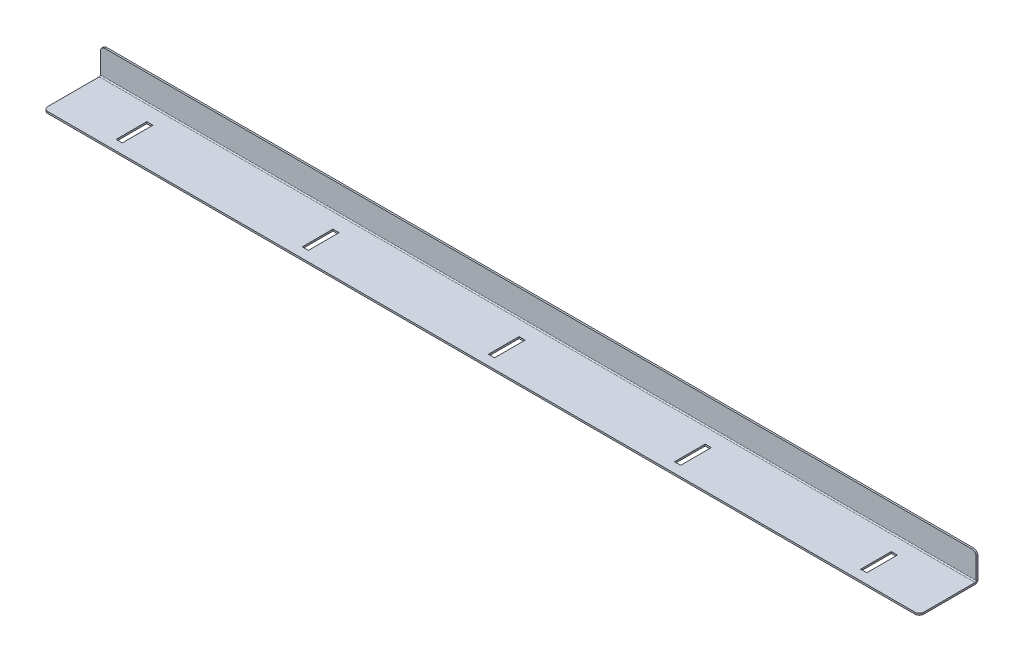
ISO-10303-21;
HEADER;
FILE_DESCRIPTION(('STEP AP214'),'2;1');
FILE_NAME('part.step','',(''),(''),'','','');
FILE_SCHEMA(('AUTOMOTIVE_DESIGN { 1 0 10303 214 1 1 1 1 }'));
ENDSEC;
DATA;
#1=APPLICATION_CONTEXT('core data for automotive mechanical design processes');
#2=APPLICATION_PROTOCOL_DEFINITION('international standard','automotive_design',2000,#1);
#3=PRODUCT_CONTEXT('',#1,'mechanical');
#4=PRODUCT('Part','Part','',(#3));
#5=PRODUCT_RELATED_PRODUCT_CATEGORY('part','',(#4));
#6=PRODUCT_DEFINITION_FORMATION('','',#4);
#7=PRODUCT_DEFINITION_CONTEXT('part definition',#1,'design');
#8=PRODUCT_DEFINITION('design','',#6,#7);
#9=PRODUCT_DEFINITION_SHAPE('','',#8);
#10=(LENGTH_UNIT() NAMED_UNIT(*) SI_UNIT(.MILLI.,.METRE.));
#11=(NAMED_UNIT(*) PLANE_ANGLE_UNIT() SI_UNIT($,.RADIAN.));
#12=(NAMED_UNIT(*) SI_UNIT($,.STERADIAN.) SOLID_ANGLE_UNIT());
#13=UNCERTAINTY_MEASURE_WITH_UNIT(LENGTH_MEASURE(1.E-05),#10,'distance_accuracy_value','');
#14=(GEOMETRIC_REPRESENTATION_CONTEXT(3) GLOBAL_UNCERTAINTY_ASSIGNED_CONTEXT((#13)) GLOBAL_UNIT_ASSIGNED_CONTEXT((#10,
#11,#12)) REPRESENTATION_CONTEXT('',''));
#15=CARTESIAN_POINT('',(0.,0.,0.));
#16=DIRECTION('',(0.,0.,1.));
#17=DIRECTION('',(1.,0.,0.));
#18=AXIS2_PLACEMENT_3D('',#15,#16,#17);
#19=CARTESIAN_POINT('',(500.,1.3,0.));
#20=DIRECTION('',(1.,0.,0.));
#21=DIRECTION('',(0.,0.,-1.));
#22=AXIS2_PLACEMENT_3D('',#19,#20,#21);
#23=PLANE('',#22);
#24=DIRECTION('',(0.,0.,-1.));
#25=VECTOR('',#24,1.);
#26=CARTESIAN_POINT('',(500.,1.3,0.));
#27=LINE('',#26,#25);
#28=CARTESIAN_POINT('',(500.,1.3,0.));
#29=VERTEX_POINT('',#28);
#30=CARTESIAN_POINT('',(500.,1.3,-2.));
#31=VERTEX_POINT('',#30);
#32=EDGE_CURVE('E424',#29,#31,#27,.T.);
#33=ORIENTED_EDGE('',*,*,#32,.F.);
#34=CARTESIAN_POINT('',(500.,1.3,1.3));
#35=DIRECTION('',(1.,0.,0.));
#36=DIRECTION('',(0.,0.,-1.));
#37=AXIS2_PLACEMENT_3D('',#34,#35,#36);
#38=CIRCLE('',#37,1.3);
#39=CARTESIAN_POINT('',(500.,0.,1.3));
#40=VERTEX_POINT('',#39);
#41=EDGE_CURVE('E368',#40,#29,#38,.T.);
#42=ORIENTED_EDGE('',*,*,#41,.F.);
#43=DIRECTION('',(0.,1.,0.));
#44=VECTOR('',#43,1.);
#45=CARTESIAN_POINT('',(500.,-2.,1.3));
#46=LINE('',#45,#44);
#47=CARTESIAN_POINT('',(500.,-2.,1.3));
#48=VERTEX_POINT('',#47);
#49=EDGE_CURVE('E421',#48,#40,#46,.T.);
#50=ORIENTED_EDGE('',*,*,#49,.F.);
#51=CARTESIAN_POINT('',(500.,1.3,1.3));
#52=DIRECTION('',(1.,0.,0.));
#53=DIRECTION('',(0.,0.,-1.));
#54=AXIS2_PLACEMENT_3D('',#51,#52,#53);
#55=CIRCLE('',#54,3.3);
#56=EDGE_CURVE('E375',#48,#31,#55,.T.);
#57=ORIENTED_EDGE('',*,*,#56,.T.);
#58=EDGE_LOOP('',(#33,#42,#50,#57));
#59=FACE_BOUND('',#58,.T.);
#60=ADVANCED_FACE('F38',(#59),#23,.T.);
#61=CARTESIAN_POINT('',(500.,-2.,1.3));
#62=DIRECTION('',(1.,0.,0.));
#63=DIRECTION('',(0.,0.,-1.));
#64=AXIS2_PLACEMENT_3D('',#61,#62,#63);
#65=PLANE('',#64);
#66=DIRECTION('',(0.,1.,0.));
#67=VECTOR('',#66,1.);
#68=CARTESIAN_POINT('',(500.,0.,-2.));
#69=LINE('',#68,#67);
#70=CARTESIAN_POINT('',(500.,25.,-2.));
#71=VERTEX_POINT('',#70);
#72=EDGE_CURVE('E361',#31,#71,#69,.T.);
#73=ORIENTED_EDGE('',*,*,#72,.T.);
#74=DIRECTION('',(0.,0.,-1.));
#75=VECTOR('',#74,1.);
#76=CARTESIAN_POINT('',(500.,25.,1.3));
#77=LINE('',#76,#75);
#78=CARTESIAN_POINT('',(500.,25.,0.));
#79=VERTEX_POINT('',#78);
#80=EDGE_CURVE('E435',#71,#79,#77,.F.);
#81=ORIENTED_EDGE('',*,*,#80,.T.);
#82=DIRECTION('',(0.,1.,0.));
#83=VECTOR('',#82,1.);
#84=CARTESIAN_POINT('',(500.,0.,0.));
#85=LINE('',#84,#83);
#86=EDGE_CURVE('E364',#29,#79,#85,.T.);
#87=ORIENTED_EDGE('',*,*,#86,.F.);
#88=ORIENTED_EDGE('',*,*,#32,.T.);
#89=EDGE_LOOP('',(#73,#81,#87,#88));
#90=FACE_BOUND('',#89,.T.);
#91=ADVANCED_FACE('F545',(#90),#65,.T.);
#92=CARTESIAN_POINT('',(-500.,0.,1.3));
#93=DIRECTION('',(-1.,0.,0.));
#94=DIRECTION('',(0.,0.,1.));
#95=AXIS2_PLACEMENT_3D('',#92,#93,#94);
#96=PLANE('',#95);
#97=DIRECTION('',(0.,-1.,0.));
#98=VECTOR('',#97,1.);
#99=CARTESIAN_POINT('',(-500.,0.,1.3));
#100=LINE('',#99,#98);
#101=CARTESIAN_POINT('',(-500.,0.,1.3));
#102=VERTEX_POINT('',#101);
#103=CARTESIAN_POINT('',(-500.,-2.,1.3));
#104=VERTEX_POINT('',#103);
#105=EDGE_CURVE('E418',#102,#104,#100,.T.);
#106=ORIENTED_EDGE('',*,*,#105,.F.);
#107=CARTESIAN_POINT('',(-500.,1.3,1.3));
#108=DIRECTION('',(1.,0.,0.));
#109=DIRECTION('',(0.,0.,-1.));
#110=AXIS2_PLACEMENT_3D('',#107,#108,#109);
#111=CIRCLE('',#110,1.3);
#112=CARTESIAN_POINT('',(-500.,1.3,0.));
#113=VERTEX_POINT('',#112);
#114=EDGE_CURVE('E384',#102,#113,#111,.T.);
#115=ORIENTED_EDGE('',*,*,#114,.T.);
#116=DIRECTION('',(0.,0.,1.));
#117=VECTOR('',#116,1.);
#118=CARTESIAN_POINT('',(-500.,1.3,-2.));
#119=LINE('',#118,#117);
#120=CARTESIAN_POINT('',(-500.,1.3,-2.));
#121=VERTEX_POINT('',#120);
#122=EDGE_CURVE('E416',#121,#113,#119,.T.);
#123=ORIENTED_EDGE('',*,*,#122,.F.);
#124=CARTESIAN_POINT('',(-500.,1.3,1.3));
#125=DIRECTION('',(1.,0.,0.));
#126=DIRECTION('',(0.,0.,-1.));
#127=AXIS2_PLACEMENT_3D('',#124,#125,#126);
#128=CIRCLE('',#127,3.3);
#129=EDGE_CURVE('E365',#104,#121,#128,.T.);
#130=ORIENTED_EDGE('',*,*,#129,.F.);
#131=EDGE_LOOP('',(#106,#115,#123,#130));
#132=FACE_BOUND('',#131,.T.);
#133=ADVANCED_FACE('F551',(#132),#96,.T.);
#134=CARTESIAN_POINT('',(-500.,1.3,-2.));
#135=DIRECTION('',(-1.,0.,0.));
#136=DIRECTION('',(0.,0.,1.));
#137=AXIS2_PLACEMENT_3D('',#134,#135,#136);
#138=PLANE('',#137);
#139=DIRECTION('',(0.,0.,-1.));
#140=VECTOR('',#139,1.);
#141=CARTESIAN_POINT('',(-500.,-2.,0.));
#142=LINE('',#141,#140);
#143=CARTESIAN_POINT('',(-500.,-2.00000000000001,60.));
#144=VERTEX_POINT('',#143);
#145=EDGE_CURVE('E389',#144,#104,#142,.T.);
#146=ORIENTED_EDGE('',*,*,#145,.F.);
#147=DIRECTION('',(0.,1.,0.));
#148=VECTOR('',#147,1.);
#149=CARTESIAN_POINT('',(-500.,1.3,60.));
#150=LINE('',#149,#148);
#151=CARTESIAN_POINT('',(-500.,0.,60.));
#152=VERTEX_POINT('',#151);
#153=EDGE_CURVE('E456',#144,#152,#150,.T.);
#154=ORIENTED_EDGE('',*,*,#153,.T.);
#155=DIRECTION('',(0.,0.,-1.));
#156=VECTOR('',#155,1.);
#157=CARTESIAN_POINT('',(-500.,0.,0.));
#158=LINE('',#157,#156);
#159=EDGE_CURVE('E387',#152,#102,#158,.T.);
#160=ORIENTED_EDGE('',*,*,#159,.T.);
#161=ORIENTED_EDGE('',*,*,#105,.T.);
#162=EDGE_LOOP('',(#146,#154,#160,#161));
#163=FACE_BOUND('',#162,.T.);
#164=ADVANCED_FACE('F581',(#163),#138,.T.);
#165=CARTESIAN_POINT('',(500.,0.,-2.));
#166=DIRECTION('',(0.,0.,1.));
#167=DIRECTION('',(1.,0.,0.));
#168=AXIS2_PLACEMENT_3D('',#165,#166,#167);
#169=PLANE('',#168);
#170=DIRECTION('',(-1.,0.,0.));
#171=VECTOR('',#170,1.);
#172=CARTESIAN_POINT('',(500.,30.,-2.));
#173=LINE('',#172,#171);
#174=CARTESIAN_POINT('',(495.,30.,-2.));
#175=VERTEX_POINT('',#174);
#176=CARTESIAN_POINT('',(-495.,30.,-2.));
#177=VERTEX_POINT('',#176);
#178=EDGE_CURVE('E413',#175,#177,#173,.T.);
#179=ORIENTED_EDGE('',*,*,#178,.F.);
#180=CARTESIAN_POINT('',(495.,25.,-2.));
#181=DIRECTION('',(0.,0.,1.));
#182=DIRECTION('',(1.,0.,0.));
#183=AXIS2_PLACEMENT_3D('',#180,#181,#182);
#184=CIRCLE('',#183,5.);
#185=EDGE_CURVE('E433',#175,#71,#184,.F.);
#186=ORIENTED_EDGE('',*,*,#185,.T.);
#187=ORIENTED_EDGE('',*,*,#72,.F.);
#188=DIRECTION('',(-1.,0.,0.));
#189=VECTOR('',#188,1.);
#190=CARTESIAN_POINT('',(500.,1.3,-2.));
#191=LINE('',#190,#189);
#192=EDGE_CURVE('E378',#31,#121,#191,.T.);
#193=ORIENTED_EDGE('',*,*,#192,.T.);
#194=DIRECTION('',(0.,1.,0.));
#195=VECTOR('',#194,1.);
#196=CARTESIAN_POINT('',(-500.,0.,-2.));
#197=LINE('',#196,#195);
#198=CARTESIAN_POINT('',(-500.,25.,-2.));
#199=VERTEX_POINT('',#198);
#200=EDGE_CURVE('E354',#121,#199,#197,.T.);
#201=ORIENTED_EDGE('',*,*,#200,.T.);
#202=CARTESIAN_POINT('',(-495.,25.,-2.));
#203=DIRECTION('',(0.,0.,1.));
#204=DIRECTION('',(1.,0.,0.));
#205=AXIS2_PLACEMENT_3D('',#202,#203,#204);
#206=CIRCLE('',#205,5.);
#207=EDGE_CURVE('E431',#199,#177,#206,.F.);
#208=ORIENTED_EDGE('',*,*,#207,.T.);
#209=EDGE_LOOP('',(#179,#186,#187,#193,#201,#208));
#210=FACE_BOUND('',#209,.T.);
#211=ADVANCED_FACE('F608',(#210),#169,.F.);
#212=CARTESIAN_POINT('',(500.,30.,0.));
#213=DIRECTION('',(0.,1.,0.));
#214=DIRECTION('',(0.,0.,1.));
#215=AXIS2_PLACEMENT_3D('',#212,#213,#214);
#216=PLANE('',#215);
#217=DIRECTION('',(-1.,0.,0.));
#218=VECTOR('',#217,1.);
#219=CARTESIAN_POINT('',(500.,30.,0.));
#220=LINE('',#219,#218);
#221=CARTESIAN_POINT('',(495.,30.,0.));
#222=VERTEX_POINT('',#221);
#223=CARTESIAN_POINT('',(-495.,30.,0.));
#224=VERTEX_POINT('',#223);
#225=EDGE_CURVE('E410',#222,#224,#220,.T.);
#226=ORIENTED_EDGE('',*,*,#225,.F.);
#227=DIRECTION('',(0.,0.,-1.));
#228=VECTOR('',#227,1.);
#229=CARTESIAN_POINT('',(495.,30.,0.));
#230=LINE('',#229,#228);
#231=EDGE_CURVE('E428',#222,#175,#230,.T.);
#232=ORIENTED_EDGE('',*,*,#231,.T.);
#233=ORIENTED_EDGE('',*,*,#178,.T.);
#234=DIRECTION('',(0.,0.,-1.));
#235=VECTOR('',#234,1.);
#236=CARTESIAN_POINT('',(-495.,30.,0.));
#237=LINE('',#236,#235);
#238=EDGE_CURVE('E426',#177,#224,#237,.F.);
#239=ORIENTED_EDGE('',*,*,#238,.T.);
#240=EDGE_LOOP('',(#226,#232,#233,#239));
#241=FACE_BOUND('',#240,.T.);
#242=ADVANCED_FACE('F614',(#241),#216,.T.);
#243=CARTESIAN_POINT('',(500.,0.,0.));
#244=DIRECTION('',(0.,0.,1.));
#245=DIRECTION('',(1.,0.,0.));
#246=AXIS2_PLACEMENT_3D('',#243,#244,#245);
#247=PLANE('',#246);
#248=ORIENTED_EDGE('',*,*,#86,.T.);
#249=CARTESIAN_POINT('',(495.,25.,0.));
#250=DIRECTION('',(0.,0.,1.));
#251=DIRECTION('',(1.,0.,0.));
#252=AXIS2_PLACEMENT_3D('',#249,#250,#251);
#253=CIRCLE('',#252,5.);
#254=EDGE_CURVE('E439',#79,#222,#253,.T.);
#255=ORIENTED_EDGE('',*,*,#254,.T.);
#256=ORIENTED_EDGE('',*,*,#225,.T.);
#257=CARTESIAN_POINT('',(-495.,25.,0.));
#258=DIRECTION('',(0.,0.,1.));
#259=DIRECTION('',(1.,0.,0.));
#260=AXIS2_PLACEMENT_3D('',#257,#258,#259);
#261=CIRCLE('',#260,5.);
#262=CARTESIAN_POINT('',(-500.,25.,0.));
#263=VERTEX_POINT('',#262);
#264=EDGE_CURVE('E437',#224,#263,#261,.T.);
#265=ORIENTED_EDGE('',*,*,#264,.T.);
#266=DIRECTION('',(0.,1.,0.));
#267=VECTOR('',#266,1.);
#268=CARTESIAN_POINT('',(-500.,0.,0.));
#269=LINE('',#268,#267);
#270=EDGE_CURVE('E381',#113,#263,#269,.T.);
#271=ORIENTED_EDGE('',*,*,#270,.F.);
#272=DIRECTION('',(-1.,0.,0.));
#273=VECTOR('',#272,1.);
#274=CARTESIAN_POINT('',(500.,1.3,0.));
#275=LINE('',#274,#273);
#276=EDGE_CURVE('E407',#29,#113,#275,.T.);
#277=ORIENTED_EDGE('',*,*,#276,.F.);
#278=EDGE_LOOP('',(#248,#255,#256,#265,#271,#277));
#279=FACE_BOUND('',#278,.T.);
#280=ADVANCED_FACE('F602',(#279),#247,.T.);
#281=CARTESIAN_POINT('',(500.,1.3,1.3));
#282=DIRECTION('',(-1.,0.,0.));
#283=DIRECTION('',(0.,0.,1.));
#284=AXIS2_PLACEMENT_3D('',#281,#282,#283);
#285=CYLINDRICAL_SURFACE('',#284,1.3);
#286=ORIENTED_EDGE('',*,*,#114,.F.);
#287=DIRECTION('',(-1.,0.,0.));
#288=VECTOR('',#287,1.);
#289=CARTESIAN_POINT('',(500.,0.,1.3));
#290=LINE('',#289,#288);
#291=EDGE_CURVE('E404',#40,#102,#290,.T.);
#292=ORIENTED_EDGE('',*,*,#291,.F.);
#293=ORIENTED_EDGE('',*,*,#41,.T.);
#294=ORIENTED_EDGE('',*,*,#276,.T.);
#295=EDGE_LOOP('',(#286,#292,#293,#294));
#296=FACE_BOUND('',#295,.T.);
#297=ADVANCED_FACE('F597',(#296),#285,.F.);
#298=CARTESIAN_POINT('',(500.,0.,0.));
#299=DIRECTION('',(0.,1.,0.));
#300=DIRECTION('',(0.,0.,1.));
#301=AXIS2_PLACEMENT_3D('',#298,#299,#300);
#302=PLANE('',#301);
#303=DIRECTION('',(-1.,0.,0.));
#304=VECTOR('',#303,1.);
#305=CARTESIAN_POINT('',(3.50000000000006,0.,18.5));
#306=LINE('',#305,#304);
#307=CARTESIAN_POINT('',(3.50000000000006,0.,18.5));
#308=VERTEX_POINT('',#307);
#309=CARTESIAN_POINT('',(-3.49999999999998,0.,18.5));
#310=VERTEX_POINT('',#309);
#311=EDGE_CURVE('E53',#308,#310,#306,.T.);
#312=ORIENTED_EDGE('',*,*,#311,.F.);
#313=DIRECTION('',(0.,0.,-1.));
#314=VECTOR('',#313,1.);
#315=CARTESIAN_POINT('',(3.5,0.,53.5000000000001));
#316=LINE('',#315,#314);
#317=CARTESIAN_POINT('',(3.5,0.,53.5000000000001));
#318=VERTEX_POINT('',#317);
#319=EDGE_CURVE('E312',#318,#308,#316,.T.);
#320=ORIENTED_EDGE('',*,*,#319,.F.);
#321=DIRECTION('',(1.,0.,0.));
#322=VECTOR('',#321,1.);
#323=CARTESIAN_POINT('',(3.5,0.,53.5000000000001));
#324=LINE('',#323,#322);
#325=CARTESIAN_POINT('',(-3.5,0.,53.5000000000001));
#326=VERTEX_POINT('',#325);
#327=EDGE_CURVE('E309',#326,#318,#324,.T.);
#328=ORIENTED_EDGE('',*,*,#327,.F.);
#329=DIRECTION('',(0.,0.,1.));
#330=VECTOR('',#329,1.);
#331=CARTESIAN_POINT('',(-3.5,0.,53.5000000000001));
#332=LINE('',#331,#330);
#333=EDGE_CURVE('E305',#310,#326,#332,.T.);
#334=ORIENTED_EDGE('',*,*,#333,.F.);
#335=EDGE_LOOP('',(#312,#320,#328,#334));
#336=FACE_BOUND('',#335,.T.);
#337=DIRECTION('',(-1.,0.,0.));
#338=VECTOR('',#337,1.);
#339=CARTESIAN_POINT('',(216.,0.,18.5));
#340=LINE('',#339,#338);
#341=CARTESIAN_POINT('',(216.,0.,18.5));
#342=VERTEX_POINT('',#341);
#343=CARTESIAN_POINT('',(209.,0.,18.5));
#344=VERTEX_POINT('',#343);
#345=EDGE_CURVE('E61',#342,#344,#340,.T.);
#346=ORIENTED_EDGE('',*,*,#345,.F.);
#347=DIRECTION('',(0.,0.,-1.));
#348=VECTOR('',#347,1.);
#349=CARTESIAN_POINT('',(216.,0.,53.5000000000001));
#350=LINE('',#349,#348);
#351=CARTESIAN_POINT('',(216.,0.,53.5000000000001));
#352=VERTEX_POINT('',#351);
#353=EDGE_CURVE('E331',#352,#342,#350,.T.);
#354=ORIENTED_EDGE('',*,*,#353,.F.);
#355=DIRECTION('',(1.,0.,0.));
#356=VECTOR('',#355,1.);
#357=CARTESIAN_POINT('',(216.,0.,53.5000000000001));
#358=LINE('',#357,#356);
#359=CARTESIAN_POINT('',(209.,0.,53.5000000000001));
#360=VERTEX_POINT('',#359);
#361=EDGE_CURVE('E328',#360,#352,#358,.T.);
#362=ORIENTED_EDGE('',*,*,#361,.F.);
#363=DIRECTION('',(0.,0.,1.));
#364=VECTOR('',#363,1.);
#365=CARTESIAN_POINT('',(209.,0.,53.5000000000001));
#366=LINE('',#365,#364);
#367=EDGE_CURVE('E325',#344,#360,#366,.T.);
#368=ORIENTED_EDGE('',*,*,#367,.F.);
#369=EDGE_LOOP('',(#346,#354,#362,#368));
#370=FACE_BOUND('',#369,.T.);
#371=DIRECTION('',(-1.,0.,0.));
#372=VECTOR('',#371,1.);
#373=CARTESIAN_POINT('',(428.5,0.,18.5));
#374=LINE('',#373,#372);
#375=CARTESIAN_POINT('',(428.5,0.,18.5));
#376=VERTEX_POINT('',#375);
#377=CARTESIAN_POINT('',(421.5,0.,18.5));
#378=VERTEX_POINT('',#377);
#379=EDGE_CURVE('E270',#376,#378,#374,.T.);
#380=ORIENTED_EDGE('',*,*,#379,.F.);
#381=DIRECTION('',(0.,0.,-1.));
#382=VECTOR('',#381,1.);
#383=CARTESIAN_POINT('',(428.5,0.,53.5000000000001));
#384=LINE('',#383,#382);
#385=CARTESIAN_POINT('',(428.5,0.,53.5000000000001));
#386=VERTEX_POINT('',#385);
#387=EDGE_CURVE('E275',#386,#376,#384,.T.);
#388=ORIENTED_EDGE('',*,*,#387,.F.);
#389=DIRECTION('',(1.,0.,0.));
#390=VECTOR('',#389,1.);
#391=CARTESIAN_POINT('',(428.5,0.,53.5000000000001));
#392=LINE('',#391,#390);
#393=CARTESIAN_POINT('',(421.5,0.,53.5));
#394=VERTEX_POINT('',#393);
#395=EDGE_CURVE('E254',#394,#386,#392,.T.);
#396=ORIENTED_EDGE('',*,*,#395,.F.);
#397=DIRECTION('',(0.,0.,1.));
#398=VECTOR('',#397,1.);
#399=CARTESIAN_POINT('',(421.5,0.,53.5));
#400=LINE('',#399,#398);
#401=EDGE_CURVE('E265',#378,#394,#400,.T.);
#402=ORIENTED_EDGE('',*,*,#401,.F.);
#403=EDGE_LOOP('',(#380,#388,#396,#402));
#404=FACE_BOUND('',#403,.T.);
#405=DIRECTION('',(0.,0.,1.));
#406=VECTOR('',#405,1.);
#407=CARTESIAN_POINT('',(-428.5,0.,53.5000000000001));
#408=LINE('',#407,#406);
#409=CARTESIAN_POINT('',(-428.5,0.,18.5));
#410=VERTEX_POINT('',#409);
#411=CARTESIAN_POINT('',(-428.5,0.,53.5000000000001));
#412=VERTEX_POINT('',#411);
#413=EDGE_CURVE('E284',#410,#412,#408,.T.);
#414=ORIENTED_EDGE('',*,*,#413,.F.);
#415=DIRECTION('',(-1.,0.,0.));
#416=VECTOR('',#415,1.);
#417=CARTESIAN_POINT('',(-421.5,0.,18.5));
#418=LINE('',#417,#416);
#419=CARTESIAN_POINT('',(-421.5,0.,18.5));
#420=VERTEX_POINT('',#419);
#421=EDGE_CURVE('E292',#420,#410,#418,.T.);
#422=ORIENTED_EDGE('',*,*,#421,.F.);
#423=DIRECTION('',(0.,0.,-1.));
#424=VECTOR('',#423,1.);
#425=CARTESIAN_POINT('',(-421.5,0.,53.5000000000001));
#426=LINE('',#425,#424);
#427=CARTESIAN_POINT('',(-421.5,0.,53.5000000000001));
#428=VERTEX_POINT('',#427);
#429=EDGE_CURVE('E289',#428,#420,#426,.T.);
#430=ORIENTED_EDGE('',*,*,#429,.F.);
#431=DIRECTION('',(1.,0.,0.));
#432=VECTOR('',#431,1.);
#433=CARTESIAN_POINT('',(-421.5,0.,53.5000000000001));
#434=LINE('',#433,#432);
#435=EDGE_CURVE('E286',#412,#428,#434,.T.);
#436=ORIENTED_EDGE('',*,*,#435,.F.);
#437=EDGE_LOOP('',(#414,#422,#430,#436));
#438=FACE_BOUND('',#437,.T.);
#439=DIRECTION('',(-1.,0.,0.));
#440=VECTOR('',#439,1.);
#441=CARTESIAN_POINT('',(-209.,0.,18.5));
#442=LINE('',#441,#440);
#443=CARTESIAN_POINT('',(-209.,0.,18.5));
#444=VERTEX_POINT('',#443);
#445=CARTESIAN_POINT('',(-216.,0.,18.5));
#446=VERTEX_POINT('',#445);
#447=EDGE_CURVE('E318',#444,#446,#442,.T.);
#448=ORIENTED_EDGE('',*,*,#447,.F.);
#449=DIRECTION('',(0.,0.,-1.));
#450=VECTOR('',#449,1.);
#451=CARTESIAN_POINT('',(-209.,0.,53.5000000000001));
#452=LINE('',#451,#450);
#453=CARTESIAN_POINT('',(-209.,0.,53.5000000000001));
#454=VERTEX_POINT('',#453);
#455=EDGE_CURVE('E348',#454,#444,#452,.T.);
#456=ORIENTED_EDGE('',*,*,#455,.F.);
#457=DIRECTION('',(1.,0.,0.));
#458=VECTOR('',#457,1.);
#459=CARTESIAN_POINT('',(-209.,0.,53.5000000000001));
#460=LINE('',#459,#458);
#461=CARTESIAN_POINT('',(-216.,0.,53.5000000000001));
#462=VERTEX_POINT('',#461);
#463=EDGE_CURVE('E345',#462,#454,#460,.T.);
#464=ORIENTED_EDGE('',*,*,#463,.F.);
#465=DIRECTION('',(0.,0.,1.));
#466=VECTOR('',#465,1.);
#467=CARTESIAN_POINT('',(-216.,0.,53.5000000000001));
#468=LINE('',#467,#466);
#469=EDGE_CURVE('E342',#446,#462,#468,.T.);
#470=ORIENTED_EDGE('',*,*,#469,.F.);
#471=EDGE_LOOP('',(#448,#456,#464,#470));
#472=FACE_BOUND('',#471,.T.);
#473=DIRECTION('',(-1.,0.,0.));
#474=VECTOR('',#473,1.);
#475=CARTESIAN_POINT('',(500.,0.,65.));
#476=LINE('',#475,#474);
#477=CARTESIAN_POINT('',(495.,0.,65.));
#478=VERTEX_POINT('',#477);
#479=CARTESIAN_POINT('',(-495.,0.,65.));
#480=VERTEX_POINT('',#479);
#481=EDGE_CURVE('E401',#478,#480,#476,.T.);
#482=ORIENTED_EDGE('',*,*,#481,.F.);
#483=CARTESIAN_POINT('',(495.,0.,60.));
#484=DIRECTION('',(0.,1.,0.));
#485=DIRECTION('',(0.,0.,1.));
#486=AXIS2_PLACEMENT_3D('',#483,#484,#485);
#487=CIRCLE('',#486,5.);
#488=CARTESIAN_POINT('',(500.,0.,60.));
#489=VERTEX_POINT('',#488);
#490=EDGE_CURVE('E448',#478,#489,#487,.T.);
#491=ORIENTED_EDGE('',*,*,#490,.T.);
#492=DIRECTION('',(0.,0.,-1.));
#493=VECTOR('',#492,1.);
#494=CARTESIAN_POINT('',(500.,0.,0.));
#495=LINE('',#494,#493);
#496=EDGE_CURVE('E371',#489,#40,#495,.T.);
#497=ORIENTED_EDGE('',*,*,#496,.T.);
#498=ORIENTED_EDGE('',*,*,#291,.T.);
#499=ORIENTED_EDGE('',*,*,#159,.F.);
#500=CARTESIAN_POINT('',(-495.,0.,60.));
#501=DIRECTION('',(0.,1.,0.));
#502=DIRECTION('',(0.,0.,1.));
#503=AXIS2_PLACEMENT_3D('',#500,#501,#502);
#504=CIRCLE('',#503,5.);
#505=EDGE_CURVE('E446',#152,#480,#504,.T.);
#506=ORIENTED_EDGE('',*,*,#505,.T.);
#507=EDGE_LOOP('',(#482,#491,#497,#498,#499,#506));
#508=FACE_BOUND('',#507,.T.);
#509=ADVANCED_FACE('F272',(#336,#370,#404,#438,#472,#508),#302,.T.);
#510=CARTESIAN_POINT('',(500.,-2.00000000000001,65.));
#511=DIRECTION('',(0.,0.,1.));
#512=DIRECTION('',(1.,0.,0.));
#513=AXIS2_PLACEMENT_3D('',#510,#511,#512);
#514=PLANE('',#513);
#515=DIRECTION('',(-1.,0.,0.));
#516=VECTOR('',#515,1.);
#517=CARTESIAN_POINT('',(500.,-2.00000000000001,65.));
#518=LINE('',#517,#516);
#519=CARTESIAN_POINT('',(495.,-2.00000000000001,65.));
#520=VERTEX_POINT('',#519);
#521=CARTESIAN_POINT('',(-495.,-2.00000000000001,65.));
#522=VERTEX_POINT('',#521);
#523=EDGE_CURVE('E398',#520,#522,#518,.T.);
#524=ORIENTED_EDGE('',*,*,#523,.F.);
#525=DIRECTION('',(0.,1.,0.));
#526=VECTOR('',#525,1.);
#527=CARTESIAN_POINT('',(495.,-2.00000000000001,65.));
#528=LINE('',#527,#526);
#529=EDGE_CURVE('E443',#520,#478,#528,.T.);
#530=ORIENTED_EDGE('',*,*,#529,.T.);
#531=ORIENTED_EDGE('',*,*,#481,.T.);
#532=DIRECTION('',(0.,1.,0.));
#533=VECTOR('',#532,1.);
#534=CARTESIAN_POINT('',(-495.,-2.00000000000001,65.));
#535=LINE('',#534,#533);
#536=EDGE_CURVE('E441',#480,#522,#535,.F.);
#537=ORIENTED_EDGE('',*,*,#536,.T.);
#538=EDGE_LOOP('',(#524,#530,#531,#537));
#539=FACE_BOUND('',#538,.T.);
#540=ADVANCED_FACE('F660',(#539),#514,.T.);
#541=CARTESIAN_POINT('',(500.,-2.,0.));
#542=DIRECTION('',(0.,1.,0.));
#543=DIRECTION('',(0.,0.,1.));
#544=AXIS2_PLACEMENT_3D('',#541,#542,#543);
#545=PLANE('',#544);
#546=DIRECTION('',(0.,0.,-1.));
#547=VECTOR('',#546,1.);
#548=CARTESIAN_POINT('',(3.50000000000011,-2.,-7.8771026039753E-13));
#549=LINE('',#548,#547);
#550=CARTESIAN_POINT('',(3.5,-2.00000000000001,53.5000000000001));
#551=VERTEX_POINT('',#550);
#552=CARTESIAN_POINT('',(3.50000000000006,-2.00000000000001,18.5));
#553=VERTEX_POINT('',#552);
#554=EDGE_CURVE('E46',#551,#553,#549,.T.);
#555=ORIENTED_EDGE('',*,*,#554,.T.);
#556=DIRECTION('',(-1.,0.,0.));
#557=VECTOR('',#556,1.);
#558=CARTESIAN_POINT('',(500.,-2.,18.5));
#559=LINE('',#558,#557);
#560=CARTESIAN_POINT('',(-3.49999999999995,-2.00000000000001,18.5));
#561=VERTEX_POINT('',#560);
#562=EDGE_CURVE('E11',#553,#561,#559,.T.);
#563=ORIENTED_EDGE('',*,*,#562,.T.);
#564=DIRECTION('',(0.,0.,1.));
#565=VECTOR('',#564,1.);
#566=CARTESIAN_POINT('',(-3.49999999999995,-2.,-7.98812490643781E-13));
#567=LINE('',#566,#565);
#568=CARTESIAN_POINT('',(-3.50000000000003,-2.00000000000001,53.5000000000001));
#569=VERTEX_POINT('',#568);
#570=EDGE_CURVE('E507',#561,#569,#567,.T.);
#571=ORIENTED_EDGE('',*,*,#570,.T.);
#572=DIRECTION('',(1.,0.,0.));
#573=VECTOR('',#572,1.);
#574=CARTESIAN_POINT('',(500.,-2.00000000000001,53.5000000000001));
#575=LINE('',#574,#573);
#576=EDGE_CURVE('E510',#569,#551,#575,.T.);
#577=ORIENTED_EDGE('',*,*,#576,.T.);
#578=EDGE_LOOP('',(#555,#563,#571,#577));
#579=FACE_BOUND('',#578,.T.);
#580=DIRECTION('',(0.,0.,-1.));
#581=VECTOR('',#580,1.);
#582=CARTESIAN_POINT('',(216.,-2.,0.));
#583=LINE('',#582,#581);
#584=CARTESIAN_POINT('',(216.,-2.00000000000001,53.5000000000001));
#585=VERTEX_POINT('',#584);
#586=CARTESIAN_POINT('',(216.,-2.00000000000001,18.5));
#587=VERTEX_POINT('',#586);
#588=EDGE_CURVE('E501',#585,#587,#583,.T.);
#589=ORIENTED_EDGE('',*,*,#588,.T.);
#590=DIRECTION('',(-1.,0.,0.));
#591=VECTOR('',#590,1.);
#592=CARTESIAN_POINT('',(500.,-2.,18.5));
#593=LINE('',#592,#591);
#594=CARTESIAN_POINT('',(209.,-2.00000000000001,18.5));
#595=VERTEX_POINT('',#594);
#596=EDGE_CURVE('E504',#587,#595,#593,.T.);
#597=ORIENTED_EDGE('',*,*,#596,.T.);
#598=DIRECTION('',(0.,0.,1.));
#599=VECTOR('',#598,1.);
#600=CARTESIAN_POINT('',(209.,-2.,0.));
#601=LINE('',#600,#599);
#602=CARTESIAN_POINT('',(209.,-2.00000000000001,53.5000000000001));
#603=VERTEX_POINT('',#602);
#604=EDGE_CURVE('E495',#595,#603,#601,.T.);
#605=ORIENTED_EDGE('',*,*,#604,.T.);
#606=DIRECTION('',(1.,0.,0.));
#607=VECTOR('',#606,1.);
#608=CARTESIAN_POINT('',(500.,-2.00000000000001,53.5000000000001));
#609=LINE('',#608,#607);
#610=EDGE_CURVE('E498',#603,#585,#609,.T.);
#611=ORIENTED_EDGE('',*,*,#610,.T.);
#612=EDGE_LOOP('',(#589,#597,#605,#611));
#613=FACE_BOUND('',#612,.T.);
#614=DIRECTION('',(0.,0.,-1.));
#615=VECTOR('',#614,1.);
#616=CARTESIAN_POINT('',(428.5,-2.,-1.13646281160827E-13));
#617=LINE('',#616,#615);
#618=CARTESIAN_POINT('',(428.5,-2.00000000000001,53.5000000000001));
#619=VERTEX_POINT('',#618);
#620=CARTESIAN_POINT('',(428.5,-2.00000000000001,18.5));
#621=VERTEX_POINT('',#620);
#622=EDGE_CURVE('E489',#619,#621,#617,.T.);
#623=ORIENTED_EDGE('',*,*,#622,.T.);
#624=DIRECTION('',(-1.,0.,0.));
#625=VECTOR('',#624,1.);
#626=CARTESIAN_POINT('',(500.,-2.,18.5));
#627=LINE('',#626,#625);
#628=CARTESIAN_POINT('',(421.5,-2.00000000000001,18.5));
#629=VERTEX_POINT('',#628);
#630=EDGE_CURVE('E492',#621,#629,#627,.T.);
#631=ORIENTED_EDGE('',*,*,#630,.T.);
#632=DIRECTION('',(0.,0.,1.));
#633=VECTOR('',#632,1.);
#634=CARTESIAN_POINT('',(421.5,-2.,-1.24748511407079E-13));
#635=LINE('',#634,#633);
#636=CARTESIAN_POINT('',(421.5,-2.00000000000001,53.5));
#637=VERTEX_POINT('',#636);
#638=EDGE_CURVE('E486',#629,#637,#635,.T.);
#639=ORIENTED_EDGE('',*,*,#638,.T.);
#640=DIRECTION('',(1.,0.,0.));
#641=VECTOR('',#640,1.);
#642=CARTESIAN_POINT('',(500.,-2.00000000000001,53.5000000000001));
#643=LINE('',#642,#641);
#644=EDGE_CURVE('E257',#637,#619,#643,.T.);
#645=ORIENTED_EDGE('',*,*,#644,.T.);
#646=EDGE_LOOP('',(#623,#631,#639,#645));
#647=FACE_BOUND('',#646,.T.);
#648=DIRECTION('',(-1.,0.,0.));
#649=VECTOR('',#648,1.);
#650=CARTESIAN_POINT('',(500.,-2.,18.5));
#651=LINE('',#650,#649);
#652=CARTESIAN_POINT('',(-421.5,-2.00000000000001,18.5));
#653=VERTEX_POINT('',#652);
#654=CARTESIAN_POINT('',(-428.5,-2.,18.5));
#655=VERTEX_POINT('',#654);
#656=EDGE_CURVE('E480',#653,#655,#651,.T.);
#657=ORIENTED_EDGE('',*,*,#656,.T.);
#658=DIRECTION('',(0.,0.,1.));
#659=VECTOR('',#658,1.);
#660=CARTESIAN_POINT('',(-428.5,-2.,0.));
#661=LINE('',#660,#659);
#662=CARTESIAN_POINT('',(-428.5,-2.00000000000001,53.5000000000001));
#663=VERTEX_POINT('',#662);
#664=EDGE_CURVE('E483',#655,#663,#661,.T.);
#665=ORIENTED_EDGE('',*,*,#664,.T.);
#666=DIRECTION('',(1.,0.,0.));
#667=VECTOR('',#666,1.);
#668=CARTESIAN_POINT('',(500.,-2.00000000000001,53.5000000000001));
#669=LINE('',#668,#667);
#670=CARTESIAN_POINT('',(-421.5,-2.00000000000001,53.5000000000001));
#671=VERTEX_POINT('',#670);
#672=EDGE_CURVE('E474',#663,#671,#669,.T.);
#673=ORIENTED_EDGE('',*,*,#672,.T.);
#674=DIRECTION('',(0.,0.,-1.));
#675=VECTOR('',#674,1.);
#676=CARTESIAN_POINT('',(-421.5,-2.,0.));
#677=LINE('',#676,#675);
#678=EDGE_CURVE('E477',#671,#653,#677,.T.);
#679=ORIENTED_EDGE('',*,*,#678,.T.);
#680=EDGE_LOOP('',(#657,#665,#673,#679));
#681=FACE_BOUND('',#680,.T.);
#682=DIRECTION('',(0.,0.,-1.));
#683=VECTOR('',#682,1.);
#684=CARTESIAN_POINT('',(-209.,-2.,-5.62493589687855E-13));
#685=LINE('',#684,#683);
#686=CARTESIAN_POINT('',(-209.,-2.00000000000001,53.5000000000001));
#687=VERTEX_POINT('',#686);
#688=CARTESIAN_POINT('',(-209.,-2.00000000000001,18.5));
#689=VERTEX_POINT('',#688);
#690=EDGE_CURVE('E468',#687,#689,#685,.T.);
#691=ORIENTED_EDGE('',*,*,#690,.T.);
#692=DIRECTION('',(-1.,0.,0.));
#693=VECTOR('',#692,1.);
#694=CARTESIAN_POINT('',(500.,-2.,18.5));
#695=LINE('',#694,#693);
#696=CARTESIAN_POINT('',(-216.,-2.00000000000001,18.5));
#697=VERTEX_POINT('',#696);
#698=EDGE_CURVE('E471',#689,#697,#695,.T.);
#699=ORIENTED_EDGE('',*,*,#698,.T.);
#700=DIRECTION('',(0.,0.,1.));
#701=VECTOR('',#700,1.);
#702=CARTESIAN_POINT('',(-216.,-2.,-5.68044704810981E-13));
#703=LINE('',#702,#701);
#704=CARTESIAN_POINT('',(-216.,-2.00000000000001,53.5000000000001));
#705=VERTEX_POINT('',#704);
#706=EDGE_CURVE('E462',#697,#705,#703,.T.);
#707=ORIENTED_EDGE('',*,*,#706,.T.);
#708=DIRECTION('',(1.,0.,0.));
#709=VECTOR('',#708,1.);
#710=CARTESIAN_POINT('',(500.,-2.00000000000001,53.5000000000001));
#711=LINE('',#710,#709);
#712=EDGE_CURVE('E465',#705,#687,#711,.T.);
#713=ORIENTED_EDGE('',*,*,#712,.T.);
#714=EDGE_LOOP('',(#691,#699,#707,#713));
#715=FACE_BOUND('',#714,.T.);
#716=DIRECTION('',(0.,0.,-1.));
#717=VECTOR('',#716,1.);
#718=CARTESIAN_POINT('',(500.,-2.,0.));
#719=LINE('',#718,#717);
#720=CARTESIAN_POINT('',(500.,-2.00000000000001,60.));
#721=VERTEX_POINT('',#720);
#722=EDGE_CURVE('E373',#721,#48,#719,.T.);
#723=ORIENTED_EDGE('',*,*,#722,.F.);
#724=CARTESIAN_POINT('',(495.,-2.00000000000001,60.));
#725=DIRECTION('',(0.,1.,0.));
#726=DIRECTION('',(0.,0.,1.));
#727=AXIS2_PLACEMENT_3D('',#724,#725,#726);
#728=CIRCLE('',#727,5.);
#729=EDGE_CURVE('E454',#721,#520,#728,.F.);
#730=ORIENTED_EDGE('',*,*,#729,.T.);
#731=ORIENTED_EDGE('',*,*,#523,.T.);
#732=CARTESIAN_POINT('',(-495.,-2.00000000000001,60.));
#733=DIRECTION('',(0.,1.,0.));
#734=DIRECTION('',(0.,0.,1.));
#735=AXIS2_PLACEMENT_3D('',#732,#733,#734);
#736=CIRCLE('',#735,5.);
#737=EDGE_CURVE('E452',#522,#144,#736,.F.);
#738=ORIENTED_EDGE('',*,*,#737,.T.);
#739=ORIENTED_EDGE('',*,*,#145,.T.);
#740=DIRECTION('',(-1.,0.,0.));
#741=VECTOR('',#740,1.);
#742=CARTESIAN_POINT('',(500.,-2.,1.3));
#743=LINE('',#742,#741);
#744=EDGE_CURVE('E395',#48,#104,#743,.T.);
#745=ORIENTED_EDGE('',*,*,#744,.F.);
#746=EDGE_LOOP('',(#723,#730,#731,#738,#739,#745));
#747=FACE_BOUND('',#746,.T.);
#748=ADVANCED_FACE('F514',(#579,#613,#647,#681,#715,#747),#545,.F.);
#749=CARTESIAN_POINT('',(500.,1.3,1.3));
#750=DIRECTION('',(-1.,0.,0.));
#751=DIRECTION('',(0.,0.,1.));
#752=AXIS2_PLACEMENT_3D('',#749,#750,#751);
#753=CYLINDRICAL_SURFACE('',#752,3.3);
#754=ORIENTED_EDGE('',*,*,#129,.T.);
#755=ORIENTED_EDGE('',*,*,#192,.F.);
#756=ORIENTED_EDGE('',*,*,#56,.F.);
#757=ORIENTED_EDGE('',*,*,#744,.T.);
#758=EDGE_LOOP('',(#754,#755,#756,#757));
#759=FACE_BOUND('',#758,.T.);
#760=ADVANCED_FACE('F588',(#759),#753,.T.);
#761=CARTESIAN_POINT('',(500.,1.3,1.3));
#762=DIRECTION('',(1.,0.,0.));
#763=DIRECTION('',(0.,0.,-1.));
#764=AXIS2_PLACEMENT_3D('',#761,#762,#763);
#765=PLANE('',#764);
#766=ORIENTED_EDGE('',*,*,#496,.F.);
#767=DIRECTION('',(0.,1.,0.));
#768=VECTOR('',#767,1.);
#769=CARTESIAN_POINT('',(500.,1.3,60.));
#770=LINE('',#769,#768);
#771=EDGE_CURVE('E450',#489,#721,#770,.F.);
#772=ORIENTED_EDGE('',*,*,#771,.T.);
#773=ORIENTED_EDGE('',*,*,#722,.T.);
#774=ORIENTED_EDGE('',*,*,#49,.T.);
#775=EDGE_LOOP('',(#766,#772,#773,#774));
#776=FACE_BOUND('',#775,.T.);
#777=ADVANCED_FACE('F675',(#776),#765,.T.);
#778=CARTESIAN_POINT('',(-500.,1.3,1.3));
#779=DIRECTION('',(1.,0.,0.));
#780=DIRECTION('',(0.,0.,-1.));
#781=AXIS2_PLACEMENT_3D('',#778,#779,#780);
#782=PLANE('',#781);
#783=ORIENTED_EDGE('',*,*,#270,.T.);
#784=DIRECTION('',(0.,0.,-1.));
#785=VECTOR('',#784,1.);
#786=CARTESIAN_POINT('',(-500.,25.,-2.));
#787=LINE('',#786,#785);
#788=EDGE_CURVE('E459',#263,#199,#787,.T.);
#789=ORIENTED_EDGE('',*,*,#788,.T.);
#790=ORIENTED_EDGE('',*,*,#200,.F.);
#791=ORIENTED_EDGE('',*,*,#122,.T.);
#792=EDGE_LOOP('',(#783,#789,#790,#791));
#793=FACE_BOUND('',#792,.T.);
#794=ADVANCED_FACE('F560',(#793),#782,.F.);
#795=CARTESIAN_POINT('',(495.,25.,0.));
#796=DIRECTION('',(0.,0.,-1.));
#797=DIRECTION('',(-1.,0.,0.));
#798=AXIS2_PLACEMENT_3D('',#795,#796,#797);
#799=CYLINDRICAL_SURFACE('',#798,5.);
#800=ORIENTED_EDGE('',*,*,#254,.F.);
#801=ORIENTED_EDGE('',*,*,#80,.F.);
#802=ORIENTED_EDGE('',*,*,#185,.F.);
#803=ORIENTED_EDGE('',*,*,#231,.F.);
#804=EDGE_LOOP('',(#800,#801,#802,#803));
#805=FACE_BOUND('',#804,.T.);
#806=ADVANCED_FACE('F556',(#805),#799,.T.);
#807=CARTESIAN_POINT('',(495.,-2.00000000000001,60.));
#808=DIRECTION('',(0.,1.,0.));
#809=DIRECTION('',(0.,0.,1.));
#810=AXIS2_PLACEMENT_3D('',#807,#808,#809);
#811=CYLINDRICAL_SURFACE('',#810,5.);
#812=ORIENTED_EDGE('',*,*,#729,.F.);
#813=ORIENTED_EDGE('',*,*,#771,.F.);
#814=ORIENTED_EDGE('',*,*,#490,.F.);
#815=ORIENTED_EDGE('',*,*,#529,.F.);
#816=EDGE_LOOP('',(#812,#813,#814,#815));
#817=FACE_BOUND('',#816,.T.);
#818=ADVANCED_FACE('F559',(#817),#811,.T.);
#819=CARTESIAN_POINT('',(-495.,1.3,60.));
#820=DIRECTION('',(0.,1.,0.));
#821=DIRECTION('',(0.,0.,1.));
#822=AXIS2_PLACEMENT_3D('',#819,#820,#821);
#823=CYLINDRICAL_SURFACE('',#822,5.);
#824=ORIENTED_EDGE('',*,*,#737,.F.);
#825=ORIENTED_EDGE('',*,*,#536,.F.);
#826=ORIENTED_EDGE('',*,*,#505,.F.);
#827=ORIENTED_EDGE('',*,*,#153,.F.);
#828=EDGE_LOOP('',(#824,#825,#826,#827));
#829=FACE_BOUND('',#828,.T.);
#830=ADVANCED_FACE('F563',(#829),#823,.T.);
#831=CARTESIAN_POINT('',(-495.,25.,1.3));
#832=DIRECTION('',(0.,0.,1.));
#833=DIRECTION('',(1.,0.,0.));
#834=AXIS2_PLACEMENT_3D('',#831,#832,#833);
#835=CYLINDRICAL_SURFACE('',#834,5.);
#836=ORIENTED_EDGE('',*,*,#264,.F.);
#837=ORIENTED_EDGE('',*,*,#238,.F.);
#838=ORIENTED_EDGE('',*,*,#207,.F.);
#839=ORIENTED_EDGE('',*,*,#788,.F.);
#840=EDGE_LOOP('',(#836,#837,#838,#839));
#841=FACE_BOUND('',#840,.T.);
#842=ADVANCED_FACE('F40',(#841),#835,.T.);
#843=CARTESIAN_POINT('',(-209.,-10.,18.5));
#844=DIRECTION('',(0.,0.,-1.));
#845=DIRECTION('',(0.,1.,0.));
#846=AXIS2_PLACEMENT_3D('',#843,#844,#845);
#847=PLANE('',#846);
#848=DIRECTION('',(0.,1.,0.));
#849=VECTOR('',#848,1.);
#850=CARTESIAN_POINT('',(-209.,-10.,18.5));
#851=LINE('',#850,#849);
#852=EDGE_CURVE('E352',#689,#444,#851,.T.);
#853=ORIENTED_EDGE('',*,*,#852,.T.);
#854=ORIENTED_EDGE('',*,*,#447,.T.);
#855=DIRECTION('',(0.,1.,0.));
#856=VECTOR('',#855,1.);
#857=CARTESIAN_POINT('',(-216.,-10.,18.5));
#858=LINE('',#857,#856);
#859=EDGE_CURVE('E351',#697,#446,#858,.T.);
#860=ORIENTED_EDGE('',*,*,#859,.F.);
#861=ORIENTED_EDGE('',*,*,#698,.F.);
#862=EDGE_LOOP('',(#853,#854,#860,#861));
#863=FACE_BOUND('',#862,.T.);
#864=ADVANCED_FACE('F570',(#863),#847,.F.);
#865=CARTESIAN_POINT('',(-209.,-10.,53.5000000000001));
#866=DIRECTION('',(1.,0.,0.));
#867=DIRECTION('',(0.,0.,-1.));
#868=AXIS2_PLACEMENT_3D('',#865,#866,#867);
#869=PLANE('',#868);
#870=DIRECTION('',(0.,1.,0.));
#871=VECTOR('',#870,1.);
#872=CARTESIAN_POINT('',(-209.,-10.,53.5000000000001));
#873=LINE('',#872,#871);
#874=EDGE_CURVE('E355',#687,#454,#873,.T.);
#875=ORIENTED_EDGE('',*,*,#874,.T.);
#876=ORIENTED_EDGE('',*,*,#455,.T.);
#877=ORIENTED_EDGE('',*,*,#852,.F.);
#878=ORIENTED_EDGE('',*,*,#690,.F.);
#879=EDGE_LOOP('',(#875,#876,#877,#878));
#880=FACE_BOUND('',#879,.T.);
#881=ADVANCED_FACE('F737',(#880),#869,.F.);
#882=CARTESIAN_POINT('',(-209.,-10.,53.5000000000001));
#883=DIRECTION('',(0.,0.,1.));
#884=DIRECTION('',(0.,-1.,0.));
#885=AXIS2_PLACEMENT_3D('',#882,#883,#884);
#886=PLANE('',#885);
#887=DIRECTION('',(0.,1.,0.));
#888=VECTOR('',#887,1.);
#889=CARTESIAN_POINT('',(-216.,-10.,53.5000000000001));
#890=LINE('',#889,#888);
#891=EDGE_CURVE('E357',#705,#462,#890,.T.);
#892=ORIENTED_EDGE('',*,*,#891,.T.);
#893=ORIENTED_EDGE('',*,*,#463,.T.);
#894=ORIENTED_EDGE('',*,*,#874,.F.);
#895=ORIENTED_EDGE('',*,*,#712,.F.);
#896=EDGE_LOOP('',(#892,#893,#894,#895));
#897=FACE_BOUND('',#896,.T.);
#898=ADVANCED_FACE('F748',(#897),#886,.F.);
#899=CARTESIAN_POINT('',(-216.,-10.,53.5000000000001));
#900=DIRECTION('',(-1.,0.,0.));
#901=DIRECTION('',(0.,0.,1.));
#902=AXIS2_PLACEMENT_3D('',#899,#900,#901);
#903=PLANE('',#902);
#904=ORIENTED_EDGE('',*,*,#859,.T.);
#905=ORIENTED_EDGE('',*,*,#469,.T.);
#906=ORIENTED_EDGE('',*,*,#891,.F.);
#907=ORIENTED_EDGE('',*,*,#706,.F.);
#908=EDGE_LOOP('',(#904,#905,#906,#907));
#909=FACE_BOUND('',#908,.T.);
#910=ADVANCED_FACE('F759',(#909),#903,.F.);
#911=CARTESIAN_POINT('',(-428.5,-10.,53.5000000000001));
#912=DIRECTION('',(-1.,0.,0.));
#913=DIRECTION('',(0.,0.,1.));
#914=AXIS2_PLACEMENT_3D('',#911,#912,#913);
#915=PLANE('',#914);
#916=DIRECTION('',(0.,1.,0.));
#917=VECTOR('',#916,1.);
#918=CARTESIAN_POINT('',(-428.5,-10.,18.5));
#919=LINE('',#918,#917);
#920=EDGE_CURVE('E296',#655,#410,#919,.T.);
#921=ORIENTED_EDGE('',*,*,#920,.T.);
#922=ORIENTED_EDGE('',*,*,#413,.T.);
#923=DIRECTION('',(0.,1.,0.));
#924=VECTOR('',#923,1.);
#925=CARTESIAN_POINT('',(-428.5,-10.,53.5000000000001));
#926=LINE('',#925,#924);
#927=EDGE_CURVE('E295',#663,#412,#926,.T.);
#928=ORIENTED_EDGE('',*,*,#927,.F.);
#929=ORIENTED_EDGE('',*,*,#664,.F.);
#930=EDGE_LOOP('',(#921,#922,#928,#929));
#931=FACE_BOUND('',#930,.T.);
#932=ADVANCED_FACE('F770',(#931),#915,.F.);
#933=CARTESIAN_POINT('',(-421.5,-10.,18.5));
#934=DIRECTION('',(0.,0.,-1.));
#935=DIRECTION('',(0.,1.,0.));
#936=AXIS2_PLACEMENT_3D('',#933,#934,#935);
#937=PLANE('',#936);
#938=DIRECTION('',(0.,1.,0.));
#939=VECTOR('',#938,1.);
#940=CARTESIAN_POINT('',(-421.5,-10.,18.5));
#941=LINE('',#940,#939);
#942=EDGE_CURVE('E298',#653,#420,#941,.T.);
#943=ORIENTED_EDGE('',*,*,#942,.T.);
#944=ORIENTED_EDGE('',*,*,#421,.T.);
#945=ORIENTED_EDGE('',*,*,#920,.F.);
#946=ORIENTED_EDGE('',*,*,#656,.F.);
#947=EDGE_LOOP('',(#943,#944,#945,#946));
#948=FACE_BOUND('',#947,.T.);
#949=ADVANCED_FACE('F781',(#948),#937,.F.);
#950=CARTESIAN_POINT('',(-421.5,-10.,53.5000000000001));
#951=DIRECTION('',(1.,0.,0.));
#952=DIRECTION('',(0.,0.,-1.));
#953=AXIS2_PLACEMENT_3D('',#950,#951,#952);
#954=PLANE('',#953);
#955=DIRECTION('',(0.,1.,0.));
#956=VECTOR('',#955,1.);
#957=CARTESIAN_POINT('',(-421.5,-10.,53.5000000000001));
#958=LINE('',#957,#956);
#959=EDGE_CURVE('E300',#671,#428,#958,.T.);
#960=ORIENTED_EDGE('',*,*,#959,.T.);
#961=ORIENTED_EDGE('',*,*,#429,.T.);
#962=ORIENTED_EDGE('',*,*,#942,.F.);
#963=ORIENTED_EDGE('',*,*,#678,.F.);
#964=EDGE_LOOP('',(#960,#961,#962,#963));
#965=FACE_BOUND('',#964,.T.);
#966=ADVANCED_FACE('F792',(#965),#954,.F.);
#967=CARTESIAN_POINT('',(-421.5,-10.,53.5000000000001));
#968=DIRECTION('',(0.,0.,1.));
#969=DIRECTION('',(0.,-1.,0.));
#970=AXIS2_PLACEMENT_3D('',#967,#968,#969);
#971=PLANE('',#970);
#972=ORIENTED_EDGE('',*,*,#927,.T.);
#973=ORIENTED_EDGE('',*,*,#435,.T.);
#974=ORIENTED_EDGE('',*,*,#959,.F.);
#975=ORIENTED_EDGE('',*,*,#672,.F.);
#976=EDGE_LOOP('',(#972,#973,#974,#975));
#977=FACE_BOUND('',#976,.T.);
#978=ADVANCED_FACE('F803',(#977),#971,.F.);
#979=CARTESIAN_POINT('',(428.5,-10.,18.5));
#980=DIRECTION('',(0.,0.,-1.));
#981=DIRECTION('',(0.,1.,0.));
#982=AXIS2_PLACEMENT_3D('',#979,#980,#981);
#983=PLANE('',#982);
#984=DIRECTION('',(0.,1.,0.));
#985=VECTOR('',#984,1.);
#986=CARTESIAN_POINT('',(428.5,-10.,18.5));
#987=LINE('',#986,#985);
#988=EDGE_CURVE('E280',#621,#376,#987,.T.);
#989=ORIENTED_EDGE('',*,*,#988,.T.);
#990=ORIENTED_EDGE('',*,*,#379,.T.);
#991=DIRECTION('',(0.,1.,0.));
#992=VECTOR('',#991,1.);
#993=CARTESIAN_POINT('',(421.5,-10.,18.5));
#994=LINE('',#993,#992);
#995=EDGE_CURVE('E261',#629,#378,#994,.T.);
#996=ORIENTED_EDGE('',*,*,#995,.F.);
#997=ORIENTED_EDGE('',*,*,#630,.F.);
#998=EDGE_LOOP('',(#989,#990,#996,#997));
#999=FACE_BOUND('',#998,.T.);
#1000=ADVANCED_FACE('F814',(#999),#983,.F.);
#1001=CARTESIAN_POINT('',(428.5,-10.,53.5000000000001));
#1002=DIRECTION('',(1.,0.,0.));
#1003=DIRECTION('',(0.,0.,-1.));
#1004=AXIS2_PLACEMENT_3D('',#1001,#1002,#1003);
#1005=PLANE('',#1004);
#1006=DIRECTION('',(0.,1.,0.));
#1007=VECTOR('',#1006,1.);
#1008=CARTESIAN_POINT('',(428.5,-10.,53.5000000000001));
#1009=LINE('',#1008,#1007);
#1010=EDGE_CURVE('E260',#619,#386,#1009,.T.);
#1011=ORIENTED_EDGE('',*,*,#1010,.T.);
#1012=ORIENTED_EDGE('',*,*,#387,.T.);
#1013=ORIENTED_EDGE('',*,*,#988,.F.);
#1014=ORIENTED_EDGE('',*,*,#622,.F.);
#1015=EDGE_LOOP('',(#1011,#1012,#1013,#1014));
#1016=FACE_BOUND('',#1015,.T.);
#1017=ADVANCED_FACE('F825',(#1016),#1005,.F.);
#1018=CARTESIAN_POINT('',(428.5,-10.,53.5000000000001));
#1019=DIRECTION('',(0.,0.,1.));
#1020=DIRECTION('',(1.,0.,0.));
#1021=AXIS2_PLACEMENT_3D('',#1018,#1019,#1020);
#1022=PLANE('',#1021);
#1023=DIRECTION('',(0.,1.,0.));
#1024=VECTOR('',#1023,1.);
#1025=CARTESIAN_POINT('',(421.5,-10.,53.5));
#1026=LINE('',#1025,#1024);
#1027=EDGE_CURVE('E249',#637,#394,#1026,.T.);
#1028=ORIENTED_EDGE('',*,*,#1027,.T.);
#1029=ORIENTED_EDGE('',*,*,#395,.T.);
#1030=ORIENTED_EDGE('',*,*,#1010,.F.);
#1031=ORIENTED_EDGE('',*,*,#644,.F.);
#1032=EDGE_LOOP('',(#1028,#1029,#1030,#1031));
#1033=FACE_BOUND('',#1032,.T.);
#1034=ADVANCED_FACE('F251',(#1033),#1022,.F.);
#1035=CARTESIAN_POINT('',(421.5,-10.,53.5));
#1036=DIRECTION('',(-1.,0.,0.));
#1037=DIRECTION('',(0.,0.,1.));
#1038=AXIS2_PLACEMENT_3D('',#1035,#1036,#1037);
#1039=PLANE('',#1038);
#1040=ORIENTED_EDGE('',*,*,#995,.T.);
#1041=ORIENTED_EDGE('',*,*,#401,.T.);
#1042=ORIENTED_EDGE('',*,*,#1027,.F.);
#1043=ORIENTED_EDGE('',*,*,#638,.F.);
#1044=EDGE_LOOP('',(#1040,#1041,#1042,#1043));
#1045=FACE_BOUND('',#1044,.T.);
#1046=ADVANCED_FACE('F266',(#1045),#1039,.F.);
#1047=CARTESIAN_POINT('',(216.,-10.,18.5));
#1048=DIRECTION('',(0.,0.,-1.));
#1049=DIRECTION('',(0.,1.,0.));
#1050=AXIS2_PLACEMENT_3D('',#1047,#1048,#1049);
#1051=PLANE('',#1050);
#1052=DIRECTION('',(0.,1.,0.));
#1053=VECTOR('',#1052,1.);
#1054=CARTESIAN_POINT('',(216.,-10.,18.5));
#1055=LINE('',#1054,#1053);
#1056=EDGE_CURVE('E306',#587,#342,#1055,.T.);
#1057=ORIENTED_EDGE('',*,*,#1056,.T.);
#1058=ORIENTED_EDGE('',*,*,#345,.T.);
#1059=DIRECTION('',(0.,1.,0.));
#1060=VECTOR('',#1059,1.);
#1061=CARTESIAN_POINT('',(209.,-10.,18.5));
#1062=LINE('',#1061,#1060);
#1063=EDGE_CURVE('E334',#595,#344,#1062,.T.);
#1064=ORIENTED_EDGE('',*,*,#1063,.F.);
#1065=ORIENTED_EDGE('',*,*,#596,.F.);
#1066=EDGE_LOOP('',(#1057,#1058,#1064,#1065));
#1067=FACE_BOUND('',#1066,.T.);
#1068=ADVANCED_FACE('F855',(#1067),#1051,.F.);
#1069=CARTESIAN_POINT('',(216.,-10.,53.5000000000001));
#1070=DIRECTION('',(1.,0.,0.));
#1071=DIRECTION('',(0.,0.,-1.));
#1072=AXIS2_PLACEMENT_3D('',#1069,#1070,#1071);
#1073=PLANE('',#1072);
#1074=DIRECTION('',(0.,1.,0.));
#1075=VECTOR('',#1074,1.);
#1076=CARTESIAN_POINT('',(216.,-10.,53.5000000000001));
#1077=LINE('',#1076,#1075);
#1078=EDGE_CURVE('E336',#585,#352,#1077,.T.);
#1079=ORIENTED_EDGE('',*,*,#1078,.T.);
#1080=ORIENTED_EDGE('',*,*,#353,.T.);
#1081=ORIENTED_EDGE('',*,*,#1056,.F.);
#1082=ORIENTED_EDGE('',*,*,#588,.F.);
#1083=EDGE_LOOP('',(#1079,#1080,#1081,#1082));
#1084=FACE_BOUND('',#1083,.T.);
#1085=ADVANCED_FACE('F865',(#1084),#1073,.F.);
#1086=CARTESIAN_POINT('',(216.,-10.,53.5000000000001));
#1087=DIRECTION('',(0.,0.,1.));
#1088=DIRECTION('',(0.,-1.,0.));
#1089=AXIS2_PLACEMENT_3D('',#1086,#1087,#1088);
#1090=PLANE('',#1089);
#1091=DIRECTION('',(0.,1.,0.));
#1092=VECTOR('',#1091,1.);
#1093=CARTESIAN_POINT('',(209.,-10.,53.5000000000001));
#1094=LINE('',#1093,#1092);
#1095=EDGE_CURVE('E338',#603,#360,#1094,.T.);
#1096=ORIENTED_EDGE('',*,*,#1095,.T.);
#1097=ORIENTED_EDGE('',*,*,#361,.T.);
#1098=ORIENTED_EDGE('',*,*,#1078,.F.);
#1099=ORIENTED_EDGE('',*,*,#610,.F.);
#1100=EDGE_LOOP('',(#1096,#1097,#1098,#1099));
#1101=FACE_BOUND('',#1100,.T.);
#1102=ADVANCED_FACE('F539',(#1101),#1090,.F.);
#1103=CARTESIAN_POINT('',(209.,-10.,53.5000000000001));
#1104=DIRECTION('',(-1.,0.,0.));
#1105=DIRECTION('',(0.,0.,1.));
#1106=AXIS2_PLACEMENT_3D('',#1103,#1104,#1105);
#1107=PLANE('',#1106);
#1108=ORIENTED_EDGE('',*,*,#1063,.T.);
#1109=ORIENTED_EDGE('',*,*,#367,.T.);
#1110=ORIENTED_EDGE('',*,*,#1095,.F.);
#1111=ORIENTED_EDGE('',*,*,#604,.F.);
#1112=EDGE_LOOP('',(#1108,#1109,#1110,#1111));
#1113=FACE_BOUND('',#1112,.T.);
#1114=ADVANCED_FACE('F532',(#1113),#1107,.F.);
#1115=CARTESIAN_POINT('',(3.50000000000006,-10.,18.5));
#1116=DIRECTION('',(0.,0.,-1.));
#1117=DIRECTION('',(0.,1.,0.));
#1118=AXIS2_PLACEMENT_3D('',#1115,#1116,#1117);
#1119=PLANE('',#1118);
#1120=DIRECTION('',(0.,1.,0.));
#1121=VECTOR('',#1120,1.);
#1122=CARTESIAN_POINT('',(3.50000000000006,-10.,18.5));
#1123=LINE('',#1122,#1121);
#1124=EDGE_CURVE('E316',#553,#308,#1123,.T.);
#1125=ORIENTED_EDGE('',*,*,#1124,.T.);
#1126=ORIENTED_EDGE('',*,*,#311,.T.);
#1127=DIRECTION('',(0.,1.,0.));
#1128=VECTOR('',#1127,1.);
#1129=CARTESIAN_POINT('',(-3.49999999999995,-10.,18.5));
#1130=LINE('',#1129,#1128);
#1131=EDGE_CURVE('E315',#561,#310,#1130,.T.);
#1132=ORIENTED_EDGE('',*,*,#1131,.F.);
#1133=ORIENTED_EDGE('',*,*,#562,.F.);
#1134=EDGE_LOOP('',(#1125,#1126,#1132,#1133));
#1135=FACE_BOUND('',#1134,.T.);
#1136=ADVANCED_FACE('F530',(#1135),#1119,.F.);
#1137=CARTESIAN_POINT('',(3.5,-10.,53.5000000000001));
#1138=DIRECTION('',(1.,0.,0.));
#1139=DIRECTION('',(0.,0.,-1.));
#1140=AXIS2_PLACEMENT_3D('',#1137,#1138,#1139);
#1141=PLANE('',#1140);
#1142=DIRECTION('',(0.,1.,0.));
#1143=VECTOR('',#1142,1.);
#1144=CARTESIAN_POINT('',(3.5,-10.,53.5000000000001));
#1145=LINE('',#1144,#1143);
#1146=EDGE_CURVE('E319',#551,#318,#1145,.T.);
#1147=ORIENTED_EDGE('',*,*,#1146,.T.);
#1148=ORIENTED_EDGE('',*,*,#319,.T.);
#1149=ORIENTED_EDGE('',*,*,#1124,.F.);
#1150=ORIENTED_EDGE('',*,*,#554,.F.);
#1151=EDGE_LOOP('',(#1147,#1148,#1149,#1150));
#1152=FACE_BOUND('',#1151,.T.);
#1153=ADVANCED_FACE('F520',(#1152),#1141,.F.);
#1154=CARTESIAN_POINT('',(3.5,-10.,53.5000000000001));
#1155=DIRECTION('',(0.,0.,1.));
#1156=DIRECTION('',(0.,-1.,0.));
#1157=AXIS2_PLACEMENT_3D('',#1154,#1155,#1156);
#1158=PLANE('',#1157);
#1159=DIRECTION('',(0.,1.,0.));
#1160=VECTOR('',#1159,1.);
#1161=CARTESIAN_POINT('',(-3.5,-10.,53.5000000000001));
#1162=LINE('',#1161,#1160);
#1163=EDGE_CURVE('E321',#569,#326,#1162,.T.);
#1164=ORIENTED_EDGE('',*,*,#1163,.T.);
#1165=ORIENTED_EDGE('',*,*,#327,.T.);
#1166=ORIENTED_EDGE('',*,*,#1146,.F.);
#1167=ORIENTED_EDGE('',*,*,#576,.F.);
#1168=EDGE_LOOP('',(#1164,#1165,#1166,#1167));
#1169=FACE_BOUND('',#1168,.T.);
#1170=ADVANCED_FACE('F522',(#1169),#1158,.F.);
#1171=CARTESIAN_POINT('',(-3.5,-10.,53.5000000000001));
#1172=DIRECTION('',(-1.,0.,0.));
#1173=DIRECTION('',(0.,0.,1.));
#1174=AXIS2_PLACEMENT_3D('',#1171,#1172,#1173);
#1175=PLANE('',#1174);
#1176=ORIENTED_EDGE('',*,*,#1131,.T.);
#1177=ORIENTED_EDGE('',*,*,#333,.T.);
#1178=ORIENTED_EDGE('',*,*,#1163,.F.);
#1179=ORIENTED_EDGE('',*,*,#570,.F.);
#1180=EDGE_LOOP('',(#1176,#1177,#1178,#1179));
#1181=FACE_BOUND('',#1180,.T.);
#1182=ADVANCED_FACE('F529',(#1181),#1175,.F.);
#1183=CLOSED_SHELL('',(#60,#91,#133,#164,#211,#242,#280,#297,#509,#540,#748,#760,#777,#794,#806,
#818,#830,#842,#864,#881,#898,#910,#932,#949,#966,#978,#1000,#1017,#1034,#1046,#1068,#1085,
#1102,#1114,#1136,#1153,#1170,#1182));
#1184=MANIFOLD_SOLID_BREP('B2',#1183);
#1185=ADVANCED_BREP_SHAPE_REPRESENTATION('',(#18,#1184),#14);
#1186=SHAPE_DEFINITION_REPRESENTATION(#9,#1185);
ENDSEC;
END-ISO-10303-21;
